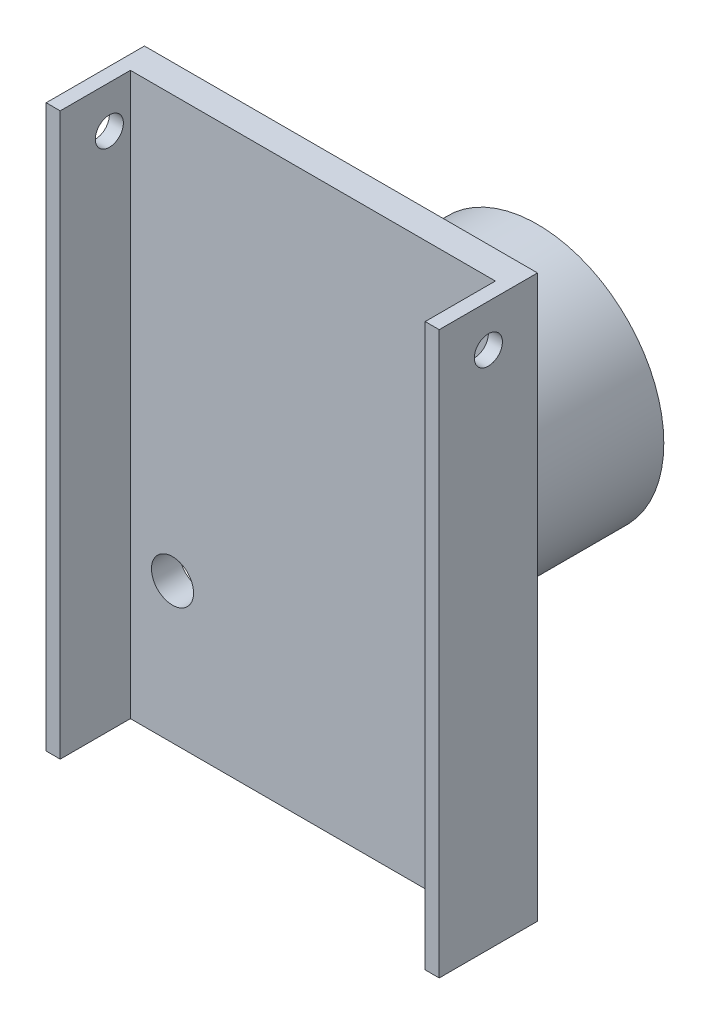
ISO-10303-21;
HEADER;
FILE_DESCRIPTION(('STEP AP214'),'2;1');
FILE_NAME('part.step','',(''),(''),'','','');
FILE_SCHEMA(('AUTOMOTIVE_DESIGN { 1 0 10303 214 1 1 1 1 }'));
ENDSEC;
DATA;
#1=APPLICATION_CONTEXT('core data for automotive mechanical design processes');
#2=APPLICATION_PROTOCOL_DEFINITION('international standard','automotive_design',2000,#1);
#3=PRODUCT_CONTEXT('',#1,'mechanical');
#4=PRODUCT('Part','Part','',(#3));
#5=PRODUCT_RELATED_PRODUCT_CATEGORY('part','',(#4));
#6=PRODUCT_DEFINITION_FORMATION('','',#4);
#7=PRODUCT_DEFINITION_CONTEXT('part definition',#1,'design');
#8=PRODUCT_DEFINITION('design','',#6,#7);
#9=PRODUCT_DEFINITION_SHAPE('','',#8);
#10=(LENGTH_UNIT() NAMED_UNIT(*) SI_UNIT(.MILLI.,.METRE.));
#11=(NAMED_UNIT(*) PLANE_ANGLE_UNIT() SI_UNIT($,.RADIAN.));
#12=(NAMED_UNIT(*) SI_UNIT($,.STERADIAN.) SOLID_ANGLE_UNIT());
#13=UNCERTAINTY_MEASURE_WITH_UNIT(LENGTH_MEASURE(1.E-05),#10,'distance_accuracy_value','');
#14=(GEOMETRIC_REPRESENTATION_CONTEXT(3) GLOBAL_UNCERTAINTY_ASSIGNED_CONTEXT((#13)) GLOBAL_UNIT_ASSIGNED_CONTEXT((#10,
#11,#12)) REPRESENTATION_CONTEXT('',''));
#15=CARTESIAN_POINT('',(0.,0.,0.));
#16=DIRECTION('',(0.,0.,1.));
#17=DIRECTION('',(1.,0.,0.));
#18=AXIS2_PLACEMENT_3D('',#15,#16,#17);
#19=CARTESIAN_POINT('',(0.,0.,10.));
#20=DIRECTION('',(0.,0.,1.));
#21=DIRECTION('',(1.,0.,0.));
#22=AXIS2_PLACEMENT_3D('',#19,#20,#21);
#23=PLANE('',#22);
#24=CARTESIAN_POINT('',(-50.,-50.,10.));
#25=DIRECTION('',(0.,0.,1.));
#26=DIRECTION('',(1.,0.,0.));
#27=AXIS2_PLACEMENT_3D('',#24,#25,#26);
#28=CIRCLE('',#27,7.5);
#29=CARTESIAN_POINT('',(-42.5,-50.,10.));
#30=VERTEX_POINT('',#29);
#31=EDGE_CURVE('E183',#30,#30,#28,.T.);
#32=ORIENTED_EDGE('',*,*,#31,.F.);
#33=EDGE_LOOP('',(#32));
#34=FACE_BOUND('',#33,.T.);
#35=CARTESIAN_POINT('',(50.,-50.,10.));
#36=DIRECTION('',(0.,0.,1.));
#37=DIRECTION('',(1.,0.,0.));
#38=AXIS2_PLACEMENT_3D('',#35,#36,#37);
#39=CIRCLE('',#38,7.5);
#40=CARTESIAN_POINT('',(57.5,-50.,10.));
#41=VERTEX_POINT('',#40);
#42=EDGE_CURVE('E175',#41,#41,#39,.T.);
#43=ORIENTED_EDGE('',*,*,#42,.F.);
#44=EDGE_LOOP('',(#43));
#45=FACE_BOUND('',#44,.T.);
#46=DIRECTION('',(1.,0.,0.));
#47=VECTOR('',#46,1.);
#48=CARTESIAN_POINT('',(-70.,-100.,10.));
#49=LINE('',#48,#47);
#50=CARTESIAN_POINT('',(-65.,-100.,10.));
#51=VERTEX_POINT('',#50);
#52=CARTESIAN_POINT('',(65.,-100.,10.));
#53=VERTEX_POINT('',#52);
#54=EDGE_CURVE('E60',#51,#53,#49,.T.);
#55=ORIENTED_EDGE('',*,*,#54,.T.);
#56=DIRECTION('',(0.,-1.,0.));
#57=VECTOR('',#56,1.);
#58=CARTESIAN_POINT('',(65.,100.,10.));
#59=LINE('',#58,#57);
#60=CARTESIAN_POINT('',(65.,100.,10.));
#61=VERTEX_POINT('',#60);
#62=EDGE_CURVE('E55',#61,#53,#59,.T.);
#63=ORIENTED_EDGE('',*,*,#62,.F.);
#64=DIRECTION('',(-1.,0.,0.));
#65=VECTOR('',#64,1.);
#66=CARTESIAN_POINT('',(-70.,100.,10.));
#67=LINE('',#66,#65);
#68=CARTESIAN_POINT('',(-65.,100.,10.));
#69=VERTEX_POINT('',#68);
#70=EDGE_CURVE('E190',#61,#69,#67,.T.);
#71=ORIENTED_EDGE('',*,*,#70,.T.);
#72=DIRECTION('',(0.,1.,0.));
#73=VECTOR('',#72,1.);
#74=CARTESIAN_POINT('',(-65.,-100.,10.));
#75=LINE('',#74,#73);
#76=EDGE_CURVE('E148',#51,#69,#75,.T.);
#77=ORIENTED_EDGE('',*,*,#76,.F.);
#78=EDGE_LOOP('',(#55,#63,#71,#77));
#79=FACE_BOUND('',#78,.T.);
#80=ADVANCED_FACE('F39',(#34,#45,#79),#23,.T.);
#81=CARTESIAN_POINT('',(0.,0.,0.));
#82=DIRECTION('',(0.,0.,1.));
#83=DIRECTION('',(1.,0.,0.));
#84=AXIS2_PLACEMENT_3D('',#81,#82,#83);
#85=PLANE('',#84);
#86=CARTESIAN_POINT('',(0.,0.,0.));
#87=DIRECTION('',(0.,0.,1.));
#88=DIRECTION('',(1.,0.,0.));
#89=AXIS2_PLACEMENT_3D('',#86,#87,#88);
#90=CIRCLE('',#89,55.);
#91=CARTESIAN_POINT('',(55.,0.,0.));
#92=VERTEX_POINT('',#91);
#93=EDGE_CURVE('E11',#92,#92,#90,.T.);
#94=ORIENTED_EDGE('',*,*,#93,.T.);
#95=EDGE_LOOP('',(#94));
#96=FACE_BOUND('',#95,.T.);
#97=DIRECTION('',(0.,1.,0.));
#98=VECTOR('',#97,1.);
#99=CARTESIAN_POINT('',(70.,100.,0.));
#100=LINE('',#99,#98);
#101=CARTESIAN_POINT('',(70.,-100.,0.));
#102=VERTEX_POINT('',#101);
#103=CARTESIAN_POINT('',(70.,100.,0.));
#104=VERTEX_POINT('',#103);
#105=EDGE_CURVE('E111',#102,#104,#100,.T.);
#106=ORIENTED_EDGE('',*,*,#105,.F.);
#107=DIRECTION('',(1.,0.,0.));
#108=VECTOR('',#107,1.);
#109=CARTESIAN_POINT('',(-70.,-100.,0.));
#110=LINE('',#109,#108);
#111=CARTESIAN_POINT('',(-70.,-100.,0.));
#112=VERTEX_POINT('',#111);
#113=EDGE_CURVE('E193',#112,#102,#110,.T.);
#114=ORIENTED_EDGE('',*,*,#113,.F.);
#115=DIRECTION('',(0.,-1.,0.));
#116=VECTOR('',#115,1.);
#117=CARTESIAN_POINT('',(-70.,100.,0.));
#118=LINE('',#117,#116);
#119=CARTESIAN_POINT('',(-70.,100.,0.));
#120=VERTEX_POINT('',#119);
#121=EDGE_CURVE('E202',#120,#112,#118,.T.);
#122=ORIENTED_EDGE('',*,*,#121,.F.);
#123=DIRECTION('',(-1.,0.,0.));
#124=VECTOR('',#123,1.);
#125=CARTESIAN_POINT('',(-70.,100.,0.));
#126=LINE('',#125,#124);
#127=EDGE_CURVE('E199',#104,#120,#126,.T.);
#128=ORIENTED_EDGE('',*,*,#127,.F.);
#129=EDGE_LOOP('',(#106,#114,#122,#128));
#130=FACE_BOUND('',#129,.T.);
#131=CARTESIAN_POINT('',(-50.,-50.,0.));
#132=DIRECTION('',(0.,0.,1.));
#133=DIRECTION('',(1.,0.,0.));
#134=AXIS2_PLACEMENT_3D('',#131,#132,#133);
#135=CIRCLE('',#134,7.5);
#136=CARTESIAN_POINT('',(-42.5,-50.,0.));
#137=VERTEX_POINT('',#136);
#138=EDGE_CURVE('E179',#137,#137,#135,.T.);
#139=ORIENTED_EDGE('',*,*,#138,.T.);
#140=EDGE_LOOP('',(#139));
#141=FACE_BOUND('',#140,.T.);
#142=CARTESIAN_POINT('',(50.,-50.,0.));
#143=DIRECTION('',(0.,0.,1.));
#144=DIRECTION('',(1.,0.,0.));
#145=AXIS2_PLACEMENT_3D('',#142,#143,#144);
#146=CIRCLE('',#145,7.5);
#147=CARTESIAN_POINT('',(57.5,-50.,0.));
#148=VERTEX_POINT('',#147);
#149=EDGE_CURVE('E174',#148,#148,#146,.T.);
#150=ORIENTED_EDGE('',*,*,#149,.T.);
#151=EDGE_LOOP('',(#150));
#152=FACE_BOUND('',#151,.T.);
#153=ADVANCED_FACE('F236',(#96,#130,#141,#152),#85,.F.);
#154=CARTESIAN_POINT('',(70.,100.,10.));
#155=DIRECTION('',(-1.,0.,0.));
#156=DIRECTION('',(0.,-1.,0.));
#157=AXIS2_PLACEMENT_3D('',#154,#155,#156);
#158=PLANE('',#157);
#159=CARTESIAN_POINT('',(70.,85.,17.5));
#160=DIRECTION('',(-1.,0.,0.));
#161=DIRECTION('',(0.,-1.,0.));
#162=AXIS2_PLACEMENT_3D('',#159,#160,#161);
#163=CIRCLE('',#162,5.);
#164=CARTESIAN_POINT('',(70.,80.,17.5));
#165=VERTEX_POINT('',#164);
#166=EDGE_CURVE('E219',#165,#165,#163,.T.);
#167=ORIENTED_EDGE('',*,*,#166,.T.);
#168=EDGE_LOOP('',(#167));
#169=FACE_BOUND('',#168,.T.);
#170=ORIENTED_EDGE('',*,*,#105,.T.);
#171=DIRECTION('',(0.,0.,-1.));
#172=VECTOR('',#171,1.);
#173=CARTESIAN_POINT('',(70.,100.,10.));
#174=LINE('',#173,#172);
#175=CARTESIAN_POINT('',(70.,100.,35.));
#176=VERTEX_POINT('',#175);
#177=EDGE_CURVE('E104',#176,#104,#174,.T.);
#178=ORIENTED_EDGE('',*,*,#177,.F.);
#179=DIRECTION('',(0.,1.,0.));
#180=VECTOR('',#179,1.);
#181=CARTESIAN_POINT('',(70.,100.,35.));
#182=LINE('',#181,#180);
#183=CARTESIAN_POINT('',(70.,-100.,35.));
#184=VERTEX_POINT('',#183);
#185=EDGE_CURVE('E109',#184,#176,#182,.T.);
#186=ORIENTED_EDGE('',*,*,#185,.F.);
#187=DIRECTION('',(0.,0.,-1.));
#188=VECTOR('',#187,1.);
#189=CARTESIAN_POINT('',(70.,-100.,10.));
#190=LINE('',#189,#188);
#191=EDGE_CURVE('E196',#184,#102,#190,.T.);
#192=ORIENTED_EDGE('',*,*,#191,.T.);
#193=EDGE_LOOP('',(#170,#178,#186,#192));
#194=FACE_BOUND('',#193,.T.);
#195=ADVANCED_FACE('F106',(#169,#194),#158,.F.);
#196=CARTESIAN_POINT('',(-70.,100.,10.));
#197=DIRECTION('',(0.,-1.,0.));
#198=DIRECTION('',(0.,0.,-1.));
#199=AXIS2_PLACEMENT_3D('',#196,#197,#198);
#200=PLANE('',#199);
#201=ORIENTED_EDGE('',*,*,#127,.T.);
#202=DIRECTION('',(0.,0.,-1.));
#203=VECTOR('',#202,1.);
#204=CARTESIAN_POINT('',(-70.,100.,10.));
#205=LINE('',#204,#203);
#206=CARTESIAN_POINT('',(-70.,100.,35.));
#207=VERTEX_POINT('',#206);
#208=EDGE_CURVE('E114',#207,#120,#205,.T.);
#209=ORIENTED_EDGE('',*,*,#208,.F.);
#210=DIRECTION('',(-1.,0.,0.));
#211=VECTOR('',#210,1.);
#212=CARTESIAN_POINT('',(-70.,100.,35.));
#213=LINE('',#212,#211);
#214=CARTESIAN_POINT('',(-65.,100.,35.));
#215=VERTEX_POINT('',#214);
#216=EDGE_CURVE('E159',#215,#207,#213,.T.);
#217=ORIENTED_EDGE('',*,*,#216,.F.);
#218=DIRECTION('',(0.,0.,-1.));
#219=VECTOR('',#218,1.);
#220=CARTESIAN_POINT('',(-65.,100.,35.));
#221=LINE('',#220,#219);
#222=EDGE_CURVE('E163',#215,#69,#221,.T.);
#223=ORIENTED_EDGE('',*,*,#222,.T.);
#224=ORIENTED_EDGE('',*,*,#70,.F.);
#225=DIRECTION('',(0.,0.,-1.));
#226=VECTOR('',#225,1.);
#227=CARTESIAN_POINT('',(65.,100.,35.));
#228=LINE('',#227,#226);
#229=CARTESIAN_POINT('',(65.,100.,35.));
#230=VERTEX_POINT('',#229);
#231=EDGE_CURVE('E120',#230,#61,#228,.T.);
#232=ORIENTED_EDGE('',*,*,#231,.F.);
#233=DIRECTION('',(-1.,0.,0.));
#234=VECTOR('',#233,1.);
#235=CARTESIAN_POINT('',(70.,100.,35.));
#236=LINE('',#235,#234);
#237=EDGE_CURVE('E117',#176,#230,#236,.T.);
#238=ORIENTED_EDGE('',*,*,#237,.F.);
#239=ORIENTED_EDGE('',*,*,#177,.T.);
#240=EDGE_LOOP('',(#201,#209,#217,#223,#224,#232,#238,#239));
#241=FACE_BOUND('',#240,.T.);
#242=ADVANCED_FACE('F118',(#241),#200,.F.);
#243=CARTESIAN_POINT('',(-70.,100.,10.));
#244=DIRECTION('',(1.,0.,0.));
#245=DIRECTION('',(0.,1.,0.));
#246=AXIS2_PLACEMENT_3D('',#243,#244,#245);
#247=PLANE('',#246);
#248=CARTESIAN_POINT('',(-70.,85.,17.5));
#249=DIRECTION('',(-1.,0.,0.));
#250=DIRECTION('',(0.,-1.,0.));
#251=AXIS2_PLACEMENT_3D('',#248,#249,#250);
#252=CIRCLE('',#251,5.);
#253=CARTESIAN_POINT('',(-70.,80.,17.5));
#254=VERTEX_POINT('',#253);
#255=EDGE_CURVE('E268',#254,#254,#252,.T.);
#256=ORIENTED_EDGE('',*,*,#255,.F.);
#257=EDGE_LOOP('',(#256));
#258=FACE_BOUND('',#257,.T.);
#259=ORIENTED_EDGE('',*,*,#121,.T.);
#260=DIRECTION('',(0.,0.,-1.));
#261=VECTOR('',#260,1.);
#262=CARTESIAN_POINT('',(-70.,-100.,10.));
#263=LINE('',#262,#261);
#264=CARTESIAN_POINT('',(-70.,-100.,35.));
#265=VERTEX_POINT('',#264);
#266=EDGE_CURVE('E209',#265,#112,#263,.T.);
#267=ORIENTED_EDGE('',*,*,#266,.F.);
#268=DIRECTION('',(0.,-1.,0.));
#269=VECTOR('',#268,1.);
#270=CARTESIAN_POINT('',(-70.,-100.,35.));
#271=LINE('',#270,#269);
#272=EDGE_CURVE('E149',#207,#265,#271,.T.);
#273=ORIENTED_EDGE('',*,*,#272,.F.);
#274=ORIENTED_EDGE('',*,*,#208,.T.);
#275=EDGE_LOOP('',(#259,#267,#273,#274));
#276=FACE_BOUND('',#275,.T.);
#277=ADVANCED_FACE('F254',(#258,#276),#247,.F.);
#278=CARTESIAN_POINT('',(-70.,-100.,10.));
#279=DIRECTION('',(0.,1.,0.));
#280=DIRECTION('',(0.,0.,1.));
#281=AXIS2_PLACEMENT_3D('',#278,#279,#280);
#282=PLANE('',#281);
#283=ORIENTED_EDGE('',*,*,#113,.T.);
#284=ORIENTED_EDGE('',*,*,#191,.F.);
#285=DIRECTION('',(1.,0.,0.));
#286=VECTOR('',#285,1.);
#287=CARTESIAN_POINT('',(70.,-100.,35.));
#288=LINE('',#287,#286);
#289=CARTESIAN_POINT('',(65.,-100.,35.));
#290=VERTEX_POINT('',#289);
#291=EDGE_CURVE('E129',#290,#184,#288,.T.);
#292=ORIENTED_EDGE('',*,*,#291,.F.);
#293=DIRECTION('',(0.,0.,-1.));
#294=VECTOR('',#293,1.);
#295=CARTESIAN_POINT('',(65.,-100.,35.));
#296=LINE('',#295,#294);
#297=EDGE_CURVE('E141',#290,#53,#296,.T.);
#298=ORIENTED_EDGE('',*,*,#297,.T.);
#299=ORIENTED_EDGE('',*,*,#54,.F.);
#300=DIRECTION('',(0.,0.,-1.));
#301=VECTOR('',#300,1.);
#302=CARTESIAN_POINT('',(-65.,-100.,35.));
#303=LINE('',#302,#301);
#304=CARTESIAN_POINT('',(-65.,-100.,35.));
#305=VERTEX_POINT('',#304);
#306=EDGE_CURVE('E170',#305,#51,#303,.T.);
#307=ORIENTED_EDGE('',*,*,#306,.F.);
#308=DIRECTION('',(1.,0.,0.));
#309=VECTOR('',#308,1.);
#310=CARTESIAN_POINT('',(-70.,-100.,35.));
#311=LINE('',#310,#309);
#312=EDGE_CURVE('E153',#265,#305,#311,.T.);
#313=ORIENTED_EDGE('',*,*,#312,.F.);
#314=ORIENTED_EDGE('',*,*,#266,.T.);
#315=EDGE_LOOP('',(#283,#284,#292,#298,#299,#307,#313,#314));
#316=FACE_BOUND('',#315,.T.);
#317=ADVANCED_FACE('F251',(#316),#282,.F.);
#318=CARTESIAN_POINT('',(-50.,-50.,10.));
#319=DIRECTION('',(0.,0.,-1.));
#320=DIRECTION('',(-1.,0.,0.));
#321=AXIS2_PLACEMENT_3D('',#318,#319,#320);
#322=CYLINDRICAL_SURFACE('',#321,7.5);
#323=ORIENTED_EDGE('',*,*,#31,.T.);
#324=EDGE_LOOP('',(#323));
#325=FACE_BOUND('',#324,.T.);
#326=ORIENTED_EDGE('',*,*,#138,.F.);
#327=EDGE_LOOP('',(#326));
#328=FACE_BOUND('',#327,.T.);
#329=ADVANCED_FACE('F248',(#325,#328),#322,.F.);
#330=CARTESIAN_POINT('',(50.,-50.,10.));
#331=DIRECTION('',(0.,0.,-1.));
#332=DIRECTION('',(-1.,0.,0.));
#333=AXIS2_PLACEMENT_3D('',#330,#331,#332);
#334=CYLINDRICAL_SURFACE('',#333,7.5);
#335=ORIENTED_EDGE('',*,*,#42,.T.);
#336=EDGE_LOOP('',(#335));
#337=FACE_BOUND('',#336,.T.);
#338=ORIENTED_EDGE('',*,*,#149,.F.);
#339=EDGE_LOOP('',(#338));
#340=FACE_BOUND('',#339,.T.);
#341=ADVANCED_FACE('F315',(#337,#340),#334,.F.);
#342=CARTESIAN_POINT('',(-65.,-100.,35.));
#343=DIRECTION('',(-1.,0.,0.));
#344=DIRECTION('',(0.,-1.,0.));
#345=AXIS2_PLACEMENT_3D('',#342,#343,#344);
#346=PLANE('',#345);
#347=CARTESIAN_POINT('',(-65.,85.,17.5));
#348=DIRECTION('',(-1.,0.,0.));
#349=DIRECTION('',(0.,-1.,0.));
#350=AXIS2_PLACEMENT_3D('',#347,#348,#349);
#351=CIRCLE('',#350,5.);
#352=CARTESIAN_POINT('',(-65.,80.,17.5));
#353=VERTEX_POINT('',#352);
#354=EDGE_CURVE('E133',#353,#353,#351,.T.);
#355=ORIENTED_EDGE('',*,*,#354,.T.);
#356=EDGE_LOOP('',(#355));
#357=FACE_BOUND('',#356,.T.);
#358=ORIENTED_EDGE('',*,*,#76,.T.);
#359=ORIENTED_EDGE('',*,*,#222,.F.);
#360=DIRECTION('',(0.,1.,0.));
#361=VECTOR('',#360,1.);
#362=CARTESIAN_POINT('',(-65.,-100.,35.));
#363=LINE('',#362,#361);
#364=EDGE_CURVE('E156',#305,#215,#363,.T.);
#365=ORIENTED_EDGE('',*,*,#364,.F.);
#366=ORIENTED_EDGE('',*,*,#306,.T.);
#367=EDGE_LOOP('',(#358,#359,#365,#366));
#368=FACE_BOUND('',#367,.T.);
#369=ADVANCED_FACE('F312',(#357,#368),#346,.F.);
#370=CARTESIAN_POINT('',(0.,0.,35.));
#371=DIRECTION('',(0.,0.,-1.));
#372=DIRECTION('',(-1.,0.,0.));
#373=AXIS2_PLACEMENT_3D('',#370,#371,#372);
#374=PLANE('',#373);
#375=ORIENTED_EDGE('',*,*,#272,.T.);
#376=ORIENTED_EDGE('',*,*,#312,.T.);
#377=ORIENTED_EDGE('',*,*,#364,.T.);
#378=ORIENTED_EDGE('',*,*,#216,.T.);
#379=EDGE_LOOP('',(#375,#376,#377,#378));
#380=FACE_BOUND('',#379,.T.);
#381=ADVANCED_FACE('F308',(#380),#374,.F.);
#382=CARTESIAN_POINT('',(65.,100.,35.));
#383=DIRECTION('',(1.,0.,0.));
#384=DIRECTION('',(0.,1.,0.));
#385=AXIS2_PLACEMENT_3D('',#382,#383,#384);
#386=PLANE('',#385);
#387=CARTESIAN_POINT('',(65.,85.,17.5));
#388=DIRECTION('',(1.,0.,0.));
#389=DIRECTION('',(0.,1.,0.));
#390=AXIS2_PLACEMENT_3D('',#387,#388,#389);
#391=CIRCLE('',#390,5.);
#392=CARTESIAN_POINT('',(65.,90.,17.5));
#393=VERTEX_POINT('',#392);
#394=EDGE_CURVE('E216',#393,#393,#391,.T.);
#395=ORIENTED_EDGE('',*,*,#394,.T.);
#396=EDGE_LOOP('',(#395));
#397=FACE_BOUND('',#396,.T.);
#398=ORIENTED_EDGE('',*,*,#62,.T.);
#399=ORIENTED_EDGE('',*,*,#297,.F.);
#400=DIRECTION('',(0.,-1.,0.));
#401=VECTOR('',#400,1.);
#402=CARTESIAN_POINT('',(65.,100.,35.));
#403=LINE('',#402,#401);
#404=EDGE_CURVE('E124',#230,#290,#403,.T.);
#405=ORIENTED_EDGE('',*,*,#404,.F.);
#406=ORIENTED_EDGE('',*,*,#231,.T.);
#407=EDGE_LOOP('',(#398,#399,#405,#406));
#408=FACE_BOUND('',#407,.T.);
#409=ADVANCED_FACE('F305',(#397,#408),#386,.F.);
#410=CARTESIAN_POINT('',(0.,0.,35.));
#411=DIRECTION('',(0.,0.,-1.));
#412=DIRECTION('',(-1.,0.,0.));
#413=AXIS2_PLACEMENT_3D('',#410,#411,#412);
#414=PLANE('',#413);
#415=ORIENTED_EDGE('',*,*,#185,.T.);
#416=ORIENTED_EDGE('',*,*,#237,.T.);
#417=ORIENTED_EDGE('',*,*,#404,.T.);
#418=ORIENTED_EDGE('',*,*,#291,.T.);
#419=EDGE_LOOP('',(#415,#416,#417,#418));
#420=FACE_BOUND('',#419,.T.);
#421=ADVANCED_FACE('F127',(#420),#414,.F.);
#422=CARTESIAN_POINT('',(70.,85.,17.5));
#423=DIRECTION('',(-1.,0.,0.));
#424=DIRECTION('',(0.,-1.,0.));
#425=AXIS2_PLACEMENT_3D('',#422,#423,#424);
#426=CYLINDRICAL_SURFACE('',#425,5.);
#427=ORIENTED_EDGE('',*,*,#166,.F.);
#428=EDGE_LOOP('',(#427));
#429=FACE_BOUND('',#428,.T.);
#430=ORIENTED_EDGE('',*,*,#394,.F.);
#431=EDGE_LOOP('',(#430));
#432=FACE_BOUND('',#431,.T.);
#433=ADVANCED_FACE('F298',(#429,#432),#426,.F.);
#434=ORIENTED_EDGE('',*,*,#255,.T.);
#435=EDGE_LOOP('',(#434));
#436=FACE_BOUND('',#435,.T.);
#437=ORIENTED_EDGE('',*,*,#354,.F.);
#438=EDGE_LOOP('',(#437));
#439=FACE_BOUND('',#438,.T.);
#440=ADVANCED_FACE('F290',(#436,#439),#426,.F.);
#441=CARTESIAN_POINT('',(0.,0.,-70.));
#442=DIRECTION('',(0.,0.,-1.));
#443=DIRECTION('',(-1.,0.,0.));
#444=AXIS2_PLACEMENT_3D('',#441,#442,#443);
#445=PLANE('',#444);
#446=CARTESIAN_POINT('',(0.,0.,-70.));
#447=DIRECTION('',(0.,0.,-1.));
#448=DIRECTION('',(-1.,0.,0.));
#449=AXIS2_PLACEMENT_3D('',#446,#447,#448);
#450=CIRCLE('',#449,45.);
#451=CARTESIAN_POINT('',(-45.,0.,-70.));
#452=VERTEX_POINT('',#451);
#453=EDGE_CURVE('E272',#452,#452,#450,.T.);
#454=ORIENTED_EDGE('',*,*,#453,.T.);
#455=EDGE_LOOP('',(#454));
#456=FACE_BOUND('',#455,.T.);
#457=CARTESIAN_POINT('',(0.,0.,-70.));
#458=DIRECTION('',(0.,0.,-1.));
#459=DIRECTION('',(-1.,0.,0.));
#460=AXIS2_PLACEMENT_3D('',#457,#458,#459);
#461=CIRCLE('',#460,35.);
#462=CARTESIAN_POINT('',(-35.,0.,-70.));
#463=VERTEX_POINT('',#462);
#464=EDGE_CURVE('E277',#463,#463,#461,.T.);
#465=ORIENTED_EDGE('',*,*,#464,.F.);
#466=EDGE_LOOP('',(#465));
#467=FACE_BOUND('',#466,.T.);
#468=ADVANCED_FACE('F288',(#456,#467),#445,.T.);
#469=CARTESIAN_POINT('',(0.,0.,-70.));
#470=DIRECTION('',(0.,0.,1.));
#471=DIRECTION('',(1.,0.,0.));
#472=AXIS2_PLACEMENT_3D('',#469,#470,#471);
#473=CYLINDRICAL_SURFACE('',#472,45.);
#474=CARTESIAN_POINT('',(0.,0.,-10.));
#475=DIRECTION('',(0.,0.,1.));
#476=DIRECTION('',(1.,0.,0.));
#477=AXIS2_PLACEMENT_3D('',#474,#475,#476);
#478=CIRCLE('',#477,45.);
#479=CARTESIAN_POINT('',(45.,0.,-10.));
#480=VERTEX_POINT('',#479);
#481=EDGE_CURVE('E48',#480,#480,#478,.F.);
#482=ORIENTED_EDGE('',*,*,#481,.T.);
#483=EDGE_LOOP('',(#482));
#484=FACE_BOUND('',#483,.T.);
#485=ORIENTED_EDGE('',*,*,#453,.F.);
#486=EDGE_LOOP('',(#485));
#487=FACE_BOUND('',#486,.T.);
#488=ADVANCED_FACE('F224',(#484,#487),#473,.T.);
#489=CARTESIAN_POINT('',(0.,0.,-70.));
#490=DIRECTION('',(0.,0.,1.));
#491=DIRECTION('',(1.,0.,0.));
#492=AXIS2_PLACEMENT_3D('',#489,#490,#491);
#493=CYLINDRICAL_SURFACE('',#492,35.);
#494=ORIENTED_EDGE('',*,*,#464,.T.);
#495=EDGE_LOOP('',(#494));
#496=FACE_BOUND('',#495,.T.);
#497=CARTESIAN_POINT('',(0.,0.,0.));
#498=DIRECTION('',(0.,0.,-1.));
#499=DIRECTION('',(-1.,0.,0.));
#500=AXIS2_PLACEMENT_3D('',#497,#498,#499);
#501=CIRCLE('',#500,35.);
#502=CARTESIAN_POINT('',(-35.,0.,0.));
#503=VERTEX_POINT('',#502);
#504=EDGE_CURVE('E278',#503,#503,#501,.T.);
#505=ORIENTED_EDGE('',*,*,#504,.F.);
#506=EDGE_LOOP('',(#505));
#507=FACE_BOUND('',#506,.T.);
#508=ADVANCED_FACE('F233',(#496,#507),#493,.F.);
#509=ORIENTED_EDGE('',*,*,#504,.T.);
#510=EDGE_LOOP('',(#509));
#511=FACE_BOUND('',#510,.T.);
#512=ADVANCED_FACE('F228',(#511),#85,.F.);
#513=CARTESIAN_POINT('',(0.,0.,-10.));
#514=DIRECTION('',(0.,0.,1.));
#515=DIRECTION('',(1.,0.,0.));
#516=AXIS2_PLACEMENT_3D('',#513,#514,#515);
#517=TOROIDAL_SURFACE('',#516,55.,10.);
#518=ORIENTED_EDGE('',*,*,#93,.F.);
#519=EDGE_LOOP('',(#518));
#520=FACE_BOUND('',#519,.T.);
#521=ORIENTED_EDGE('',*,*,#481,.F.);
#522=EDGE_LOOP('',(#521));
#523=FACE_BOUND('',#522,.T.);
#524=ADVANCED_FACE('F41',(#520,#523),#517,.F.);
#525=CLOSED_SHELL('',(#80,#153,#195,#242,#277,#317,#329,#341,#369,#381,#409,#421,#433,#440,#468,
#488,#508,#512,#524));
#526=MANIFOLD_SOLID_BREP('B2',#525);
#527=ADVANCED_BREP_SHAPE_REPRESENTATION('',(#18,#526),#14);
#528=SHAPE_DEFINITION_REPRESENTATION(#9,#527);
ENDSEC;
END-ISO-10303-21;
